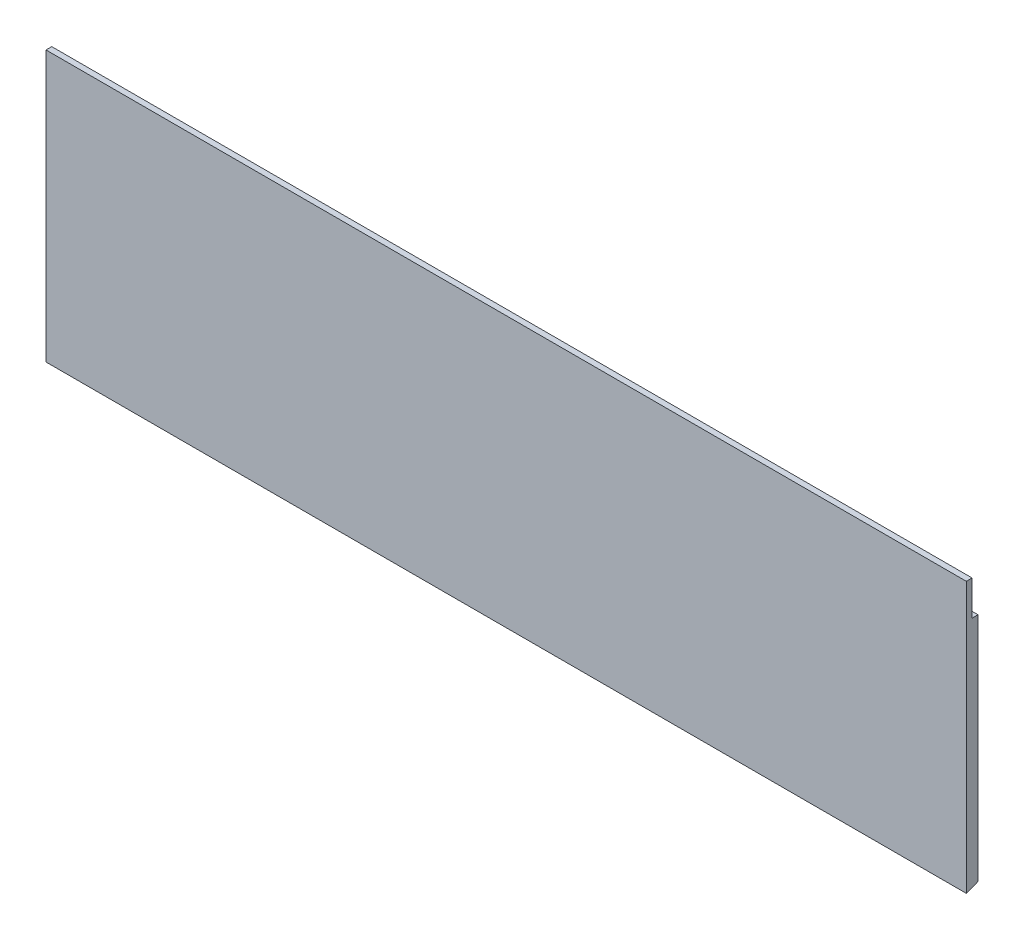
ISO-10303-21;
HEADER;
FILE_DESCRIPTION(('STEP AP214'),'2;1');
FILE_NAME('part.step','',(''),(''),'','','');
FILE_SCHEMA(('AUTOMOTIVE_DESIGN { 1 0 10303 214 1 1 1 1 }'));
ENDSEC;
DATA;
#1=APPLICATION_CONTEXT('core data for automotive mechanical design processes');
#2=APPLICATION_PROTOCOL_DEFINITION('international standard','automotive_design',2000,#1);
#3=PRODUCT_CONTEXT('',#1,'mechanical');
#4=PRODUCT('Part','Part','',(#3));
#5=PRODUCT_RELATED_PRODUCT_CATEGORY('part','',(#4));
#6=PRODUCT_DEFINITION_FORMATION('','',#4);
#7=PRODUCT_DEFINITION_CONTEXT('part definition',#1,'design');
#8=PRODUCT_DEFINITION('design','',#6,#7);
#9=PRODUCT_DEFINITION_SHAPE('','',#8);
#10=(LENGTH_UNIT() NAMED_UNIT(*) SI_UNIT(.MILLI.,.METRE.));
#11=(NAMED_UNIT(*) PLANE_ANGLE_UNIT() SI_UNIT($,.RADIAN.));
#12=(NAMED_UNIT(*) SI_UNIT($,.STERADIAN.) SOLID_ANGLE_UNIT());
#13=UNCERTAINTY_MEASURE_WITH_UNIT(LENGTH_MEASURE(1.E-05),#10,'distance_accuracy_value','');
#14=(GEOMETRIC_REPRESENTATION_CONTEXT(3) GLOBAL_UNCERTAINTY_ASSIGNED_CONTEXT((#13)) GLOBAL_UNIT_ASSIGNED_CONTEXT((#10,
#11,#12)) REPRESENTATION_CONTEXT('',''));
#15=CARTESIAN_POINT('',(0.,0.,0.));
#16=DIRECTION('',(0.,0.,1.));
#17=DIRECTION('',(1.,0.,0.));
#18=AXIS2_PLACEMENT_3D('',#15,#16,#17);
#19=CARTESIAN_POINT('',(630.999999999999,185.31,16.));
#20=DIRECTION('',(0.,-1.,0.));
#21=DIRECTION('',(0.,0.,-1.));
#22=AXIS2_PLACEMENT_3D('',#19,#20,#21);
#23=PLANE('',#22);
#24=DIRECTION('',(0.,0.,-1.));
#25=VECTOR('',#24,1.);
#26=CARTESIAN_POINT('',(630.999999999999,185.31,16.));
#27=LINE('',#26,#25);
#28=CARTESIAN_POINT('',(630.999999999999,185.31,16.));
#29=VERTEX_POINT('',#28);
#30=CARTESIAN_POINT('',(630.999999999999,185.31,8.1));
#31=VERTEX_POINT('',#30);
#32=EDGE_CURVE('E40',#29,#31,#27,.T.);
#33=ORIENTED_EDGE('',*,*,#32,.T.);
#34=DIRECTION('',(1.,0.,0.));
#35=VECTOR('',#34,1.);
#36=CARTESIAN_POINT('',(-631.000000000001,185.31,8.1));
#37=LINE('',#36,#35);
#38=CARTESIAN_POINT('',(-631.000000000001,185.31,8.1));
#39=VERTEX_POINT('',#38);
#40=EDGE_CURVE('E118',#39,#31,#37,.T.);
#41=ORIENTED_EDGE('',*,*,#40,.F.);
#42=DIRECTION('',(0.,0.,-1.));
#43=VECTOR('',#42,1.);
#44=CARTESIAN_POINT('',(-631.000000000001,185.31,16.));
#45=LINE('',#44,#43);
#46=CARTESIAN_POINT('',(-631.000000000001,185.31,16.));
#47=VERTEX_POINT('',#46);
#48=EDGE_CURVE('E11',#47,#39,#45,.T.);
#49=ORIENTED_EDGE('',*,*,#48,.F.);
#50=DIRECTION('',(-1.,0.,0.));
#51=VECTOR('',#50,1.);
#52=CARTESIAN_POINT('',(630.999999999999,185.31,16.));
#53=LINE('',#52,#51);
#54=EDGE_CURVE('E105',#29,#47,#53,.T.);
#55=ORIENTED_EDGE('',*,*,#54,.F.);
#56=EDGE_LOOP('',(#33,#41,#49,#55));
#57=FACE_BOUND('',#56,.T.);
#58=ADVANCED_FACE('F33',(#57),#23,.F.);
#59=CARTESIAN_POINT('',(-631.000000000001,185.31,16.));
#60=DIRECTION('',(1.,0.,0.));
#61=DIRECTION('',(0.,0.,-1.));
#62=AXIS2_PLACEMENT_3D('',#59,#60,#61);
#63=PLANE('',#62);
#64=DIRECTION('',(0.,-1.,0.));
#65=VECTOR('',#64,1.);
#66=CARTESIAN_POINT('',(-631.000000000001,185.31,0.));
#67=LINE('',#66,#65);
#68=CARTESIAN_POINT('',(-631.000000000001,137.61,0.));
#69=VERTEX_POINT('',#68);
#70=CARTESIAN_POINT('',(-631.000000000001,-179.168175439433,0.));
#71=VERTEX_POINT('',#70);
#72=EDGE_CURVE('E100',#69,#71,#67,.T.);
#73=ORIENTED_EDGE('',*,*,#72,.T.);
#74=DIRECTION('',(0.,-0.358367949545298,0.933580426497203));
#75=VECTOR('',#74,1.);
#76=CARTESIAN_POINT('',(-631.000000000001,-185.31,16.));
#77=LINE('',#76,#75);
#78=CARTESIAN_POINT('',(-631.000000000001,-185.31,16.));
#79=VERTEX_POINT('',#78);
#80=EDGE_CURVE('E47',#71,#79,#77,.T.);
#81=ORIENTED_EDGE('',*,*,#80,.T.);
#82=DIRECTION('',(0.,-1.,0.));
#83=VECTOR('',#82,1.);
#84=CARTESIAN_POINT('',(-631.000000000001,185.31,16.));
#85=LINE('',#84,#83);
#86=EDGE_CURVE('E92',#47,#79,#85,.T.);
#87=ORIENTED_EDGE('',*,*,#86,.F.);
#88=ORIENTED_EDGE('',*,*,#48,.T.);
#89=DIRECTION('',(0.,1.,0.));
#90=VECTOR('',#89,1.);
#91=CARTESIAN_POINT('',(-631.000000000001,185.31,8.1));
#92=LINE('',#91,#90);
#93=CARTESIAN_POINT('',(-631.000000000001,137.61,8.1));
#94=VERTEX_POINT('',#93);
#95=EDGE_CURVE('E129',#94,#39,#92,.T.);
#96=ORIENTED_EDGE('',*,*,#95,.F.);
#97=DIRECTION('',(0.,0.,-1.));
#98=VECTOR('',#97,1.);
#99=CARTESIAN_POINT('',(-631.000000000001,137.61,8.1));
#100=LINE('',#99,#98);
#101=EDGE_CURVE('E113',#94,#69,#100,.T.);
#102=ORIENTED_EDGE('',*,*,#101,.T.);
#103=EDGE_LOOP('',(#73,#81,#87,#88,#96,#102));
#104=FACE_BOUND('',#103,.T.);
#105=ADVANCED_FACE('F96',(#104),#63,.F.);
#106=CARTESIAN_POINT('',(630.999999999999,-185.31,16.));
#107=DIRECTION('',(-1.,0.,0.));
#108=DIRECTION('',(0.,0.,1.));
#109=AXIS2_PLACEMENT_3D('',#106,#107,#108);
#110=PLANE('',#109);
#111=DIRECTION('',(0.,1.,0.));
#112=VECTOR('',#111,1.);
#113=CARTESIAN_POINT('',(630.999999999999,-185.31,16.));
#114=LINE('',#113,#112);
#115=CARTESIAN_POINT('',(630.999999999999,-185.31,16.));
#116=VERTEX_POINT('',#115);
#117=EDGE_CURVE('E91',#116,#29,#114,.T.);
#118=ORIENTED_EDGE('',*,*,#117,.F.);
#119=DIRECTION('',(0.,-0.358367949545298,0.933580426497203));
#120=VECTOR('',#119,1.);
#121=CARTESIAN_POINT('',(630.999999999999,-185.31,16.));
#122=LINE('',#121,#120);
#123=CARTESIAN_POINT('',(630.999999999999,-179.168175439433,0.));
#124=VERTEX_POINT('',#123);
#125=EDGE_CURVE('E87',#124,#116,#122,.T.);
#126=ORIENTED_EDGE('',*,*,#125,.F.);
#127=DIRECTION('',(0.,1.,0.));
#128=VECTOR('',#127,1.);
#129=CARTESIAN_POINT('',(630.999999999999,-185.31,0.));
#130=LINE('',#129,#128);
#131=CARTESIAN_POINT('',(630.999999999999,137.61,0.));
#132=VERTEX_POINT('',#131);
#133=EDGE_CURVE('E55',#124,#132,#130,.T.);
#134=ORIENTED_EDGE('',*,*,#133,.T.);
#135=DIRECTION('',(0.,0.,-1.));
#136=VECTOR('',#135,1.);
#137=CARTESIAN_POINT('',(630.999999999999,137.61,8.1));
#138=LINE('',#137,#136);
#139=CARTESIAN_POINT('',(630.999999999999,137.61,8.1));
#140=VERTEX_POINT('',#139);
#141=EDGE_CURVE('E122',#140,#132,#138,.T.);
#142=ORIENTED_EDGE('',*,*,#141,.F.);
#143=DIRECTION('',(0.,-1.,0.));
#144=VECTOR('',#143,1.);
#145=CARTESIAN_POINT('',(630.999999999999,185.31,8.1));
#146=LINE('',#145,#144);
#147=EDGE_CURVE('E121',#31,#140,#146,.T.);
#148=ORIENTED_EDGE('',*,*,#147,.F.);
#149=ORIENTED_EDGE('',*,*,#32,.F.);
#150=EDGE_LOOP('',(#118,#126,#134,#142,#148,#149));
#151=FACE_BOUND('',#150,.T.);
#152=ADVANCED_FACE('F120',(#151),#110,.F.);
#153=CARTESIAN_POINT('',(0.,0.,16.));
#154=DIRECTION('',(0.,0.,1.));
#155=DIRECTION('',(1.,0.,0.));
#156=AXIS2_PLACEMENT_3D('',#153,#154,#155);
#157=PLANE('',#156);
#158=ORIENTED_EDGE('',*,*,#54,.T.);
#159=ORIENTED_EDGE('',*,*,#86,.T.);
#160=DIRECTION('',(1.,0.,0.));
#161=VECTOR('',#160,1.);
#162=CARTESIAN_POINT('',(-631.000000000001,-185.31,16.));
#163=LINE('',#162,#161);
#164=EDGE_CURVE('E85',#79,#116,#163,.T.);
#165=ORIENTED_EDGE('',*,*,#164,.T.);
#166=ORIENTED_EDGE('',*,*,#117,.T.);
#167=EDGE_LOOP('',(#158,#159,#165,#166));
#168=FACE_BOUND('',#167,.T.);
#169=ADVANCED_FACE('F103',(#168),#157,.T.);
#170=CARTESIAN_POINT('',(0.,0.,0.));
#171=DIRECTION('',(0.,0.,1.));
#172=DIRECTION('',(1.,0.,0.));
#173=AXIS2_PLACEMENT_3D('',#170,#171,#172);
#174=PLANE('',#173);
#175=ORIENTED_EDGE('',*,*,#133,.F.);
#176=DIRECTION('',(1.,0.,0.));
#177=VECTOR('',#176,1.);
#178=CARTESIAN_POINT('',(-631.000000000001,-179.168175439433,0.));
#179=LINE('',#178,#177);
#180=EDGE_CURVE('E101',#71,#124,#179,.T.);
#181=ORIENTED_EDGE('',*,*,#180,.F.);
#182=ORIENTED_EDGE('',*,*,#72,.F.);
#183=DIRECTION('',(-1.,0.,0.));
#184=VECTOR('',#183,1.);
#185=CARTESIAN_POINT('',(-631.000000000001,137.61,0.));
#186=LINE('',#185,#184);
#187=EDGE_CURVE('E133',#132,#69,#186,.T.);
#188=ORIENTED_EDGE('',*,*,#187,.F.);
#189=EDGE_LOOP('',(#175,#181,#182,#188));
#190=FACE_BOUND('',#189,.T.);
#191=ADVANCED_FACE('F139',(#190),#174,.F.);
#192=CARTESIAN_POINT('',(-631.000000000001,137.61,8.1));
#193=DIRECTION('',(0.,-1.,0.));
#194=DIRECTION('',(1.,0.,0.));
#195=AXIS2_PLACEMENT_3D('',#192,#193,#194);
#196=PLANE('',#195);
#197=ORIENTED_EDGE('',*,*,#187,.T.);
#198=ORIENTED_EDGE('',*,*,#101,.F.);
#199=DIRECTION('',(-1.,0.,0.));
#200=VECTOR('',#199,1.);
#201=CARTESIAN_POINT('',(-631.000000000001,137.61,8.1));
#202=LINE('',#201,#200);
#203=EDGE_CURVE('E126',#140,#94,#202,.T.);
#204=ORIENTED_EDGE('',*,*,#203,.F.);
#205=ORIENTED_EDGE('',*,*,#141,.T.);
#206=EDGE_LOOP('',(#197,#198,#204,#205));
#207=FACE_BOUND('',#206,.T.);
#208=ADVANCED_FACE('F137',(#207),#196,.F.);
#209=CARTESIAN_POINT('',(0.,0.,8.1));
#210=DIRECTION('',(0.,0.,1.));
#211=DIRECTION('',(1.,0.,0.));
#212=AXIS2_PLACEMENT_3D('',#209,#210,#211);
#213=PLANE('',#212);
#214=ORIENTED_EDGE('',*,*,#95,.T.);
#215=ORIENTED_EDGE('',*,*,#40,.T.);
#216=ORIENTED_EDGE('',*,*,#147,.T.);
#217=ORIENTED_EDGE('',*,*,#203,.T.);
#218=EDGE_LOOP('',(#214,#215,#216,#217));
#219=FACE_BOUND('',#218,.T.);
#220=ADVANCED_FACE('F143',(#219),#213,.F.);
#221=CARTESIAN_POINT('',(-631.000000000001,-185.31,16.));
#222=DIRECTION('',(0.,0.933580426497203,0.358367949545298));
#223=DIRECTION('',(0.,-0.358367949545298,0.933580426497203));
#224=AXIS2_PLACEMENT_3D('',#221,#222,#223);
#225=PLANE('',#224);
#226=ORIENTED_EDGE('',*,*,#125,.T.);
#227=ORIENTED_EDGE('',*,*,#164,.F.);
#228=ORIENTED_EDGE('',*,*,#80,.F.);
#229=ORIENTED_EDGE('',*,*,#180,.T.);
#230=EDGE_LOOP('',(#226,#227,#228,#229));
#231=FACE_BOUND('',#230,.T.);
#232=ADVANCED_FACE('F86',(#231),#225,.F.);
#233=CLOSED_SHELL('',(#58,#105,#152,#169,#191,#208,#220,#232));
#234=MANIFOLD_SOLID_BREP('B2',#233);
#235=ADVANCED_BREP_SHAPE_REPRESENTATION('',(#18,#234),#14);
#236=SHAPE_DEFINITION_REPRESENTATION(#9,#235);
ENDSEC;
END-ISO-10303-21;
